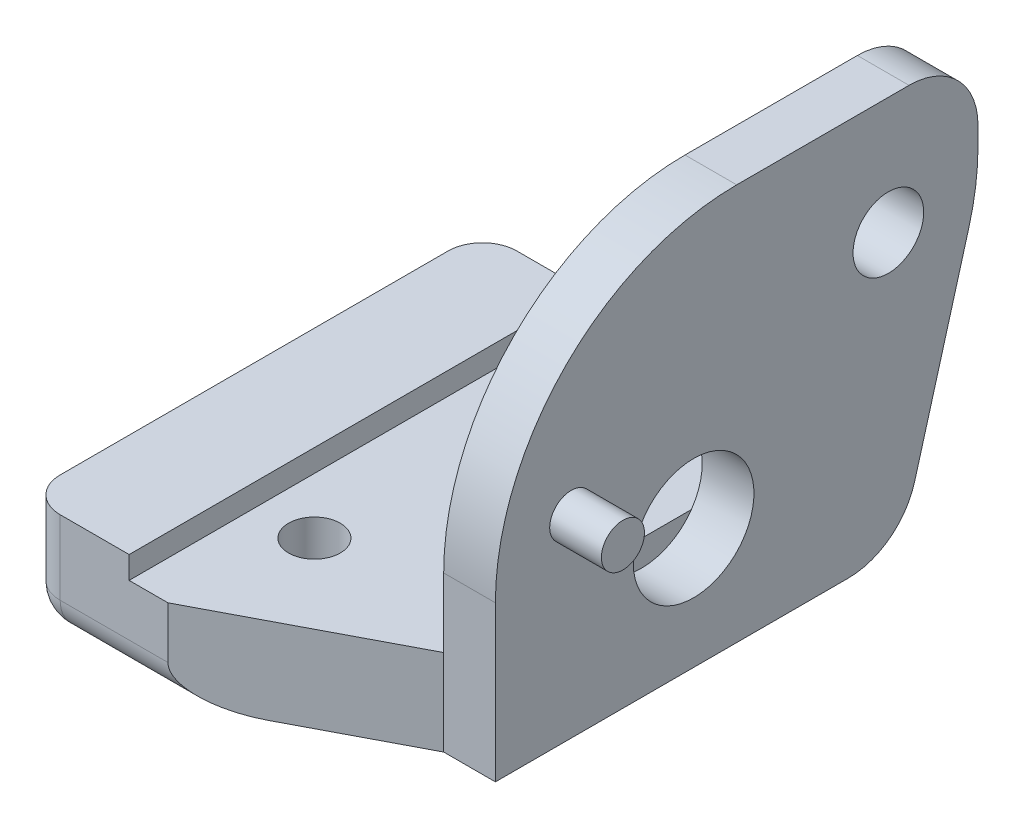
ISO-10303-21;
HEADER;
FILE_DESCRIPTION(('STEP AP214'),'2;1');
FILE_NAME('part.step','',(''),(''),'','','');
FILE_SCHEMA(('AUTOMOTIVE_DESIGN { 1 0 10303 214 1 1 1 1 }'));
ENDSEC;
DATA;
#1=APPLICATION_CONTEXT('core data for automotive mechanical design processes');
#2=APPLICATION_PROTOCOL_DEFINITION('international standard','automotive_design',2000,#1);
#3=PRODUCT_CONTEXT('',#1,'mechanical');
#4=PRODUCT('Part','Part','',(#3));
#5=PRODUCT_RELATED_PRODUCT_CATEGORY('part','',(#4));
#6=PRODUCT_DEFINITION_FORMATION('','',#4);
#7=PRODUCT_DEFINITION_CONTEXT('part definition',#1,'design');
#8=PRODUCT_DEFINITION('design','',#6,#7);
#9=PRODUCT_DEFINITION_SHAPE('','',#8);
#10=(LENGTH_UNIT() NAMED_UNIT(*) SI_UNIT(.MILLI.,.METRE.));
#11=(NAMED_UNIT(*) PLANE_ANGLE_UNIT() SI_UNIT($,.RADIAN.));
#12=(NAMED_UNIT(*) SI_UNIT($,.STERADIAN.) SOLID_ANGLE_UNIT());
#13=UNCERTAINTY_MEASURE_WITH_UNIT(LENGTH_MEASURE(1.E-05),#10,'distance_accuracy_value','');
#14=(GEOMETRIC_REPRESENTATION_CONTEXT(3) GLOBAL_UNCERTAINTY_ASSIGNED_CONTEXT((#13)) GLOBAL_UNIT_ASSIGNED_CONTEXT((#10,
#11,#12)) REPRESENTATION_CONTEXT('',''));
#15=CARTESIAN_POINT('',(0.,0.,0.));
#16=DIRECTION('',(0.,0.,1.));
#17=DIRECTION('',(1.,0.,0.));
#18=AXIS2_PLACEMENT_3D('',#15,#16,#17);
#19=CARTESIAN_POINT('',(21.75,14.,-29.5));
#20=DIRECTION('',(-1.,0.,0.));
#21=DIRECTION('',(0.,0.,1.));
#22=AXIS2_PLACEMENT_3D('',#19,#20,#21);
#23=CYLINDRICAL_SURFACE('',#22,4.);
#24=DIRECTION('',(-1.,0.,0.));
#25=VECTOR('',#24,1.);
#26=CARTESIAN_POINT('',(21.75,18.,-29.5));
#27=LINE('',#26,#25);
#28=CARTESIAN_POINT('',(21.75,18.,-29.5));
#29=VERTEX_POINT('',#28);
#30=CARTESIAN_POINT('',(18.75,18.,-29.5));
#31=VERTEX_POINT('',#30);
#32=EDGE_CURVE('E308',#29,#31,#27,.T.);
#33=ORIENTED_EDGE('',*,*,#32,.F.);
#34=CARTESIAN_POINT('',(21.75,14.,-29.5));
#35=DIRECTION('',(-1.,0.,0.));
#36=DIRECTION('',(0.,0.,1.));
#37=AXIS2_PLACEMENT_3D('',#34,#35,#36);
#38=CIRCLE('',#37,4.);
#39=CARTESIAN_POINT('',(21.75,14.,-33.5));
#40=VERTEX_POINT('',#39);
#41=EDGE_CURVE('E42',#40,#29,#38,.F.);
#42=ORIENTED_EDGE('',*,*,#41,.F.);
#43=DIRECTION('',(-1.,0.,0.));
#44=VECTOR('',#43,1.);
#45=CARTESIAN_POINT('',(21.75,14.,-33.5));
#46=LINE('',#45,#44);
#47=CARTESIAN_POINT('',(18.75,14.,-33.5));
#48=VERTEX_POINT('',#47);
#49=EDGE_CURVE('E311',#48,#40,#46,.F.);
#50=ORIENTED_EDGE('',*,*,#49,.F.);
#51=CARTESIAN_POINT('',(18.75,14.,-29.5));
#52=DIRECTION('',(-1.,0.,0.));
#53=DIRECTION('',(0.,0.,1.));
#54=AXIS2_PLACEMENT_3D('',#51,#52,#53);
#55=CIRCLE('',#54,4.);
#56=EDGE_CURVE('E11',#31,#48,#55,.T.);
#57=ORIENTED_EDGE('',*,*,#56,.F.);
#58=EDGE_LOOP('',(#33,#42,#50,#57));
#59=FACE_BOUND('',#58,.T.);
#60=ADVANCED_FACE('F35',(#59),#23,.T.);
#61=CARTESIAN_POINT('',(0.,-5.,0.));
#62=DIRECTION('',(0.,-1.,0.));
#63=DIRECTION('',(0.,0.,-1.));
#64=AXIS2_PLACEMENT_3D('',#61,#62,#63);
#65=PLANE('',#64);
#66=CARTESIAN_POINT('',(9.25,-5.,-22.5));
#67=DIRECTION('',(0.,1.,0.));
#68=DIRECTION('',(0.,0.,1.));
#69=AXIS2_PLACEMENT_3D('',#66,#67,#68);
#70=CIRCLE('',#69,1.5);
#71=CARTESIAN_POINT('',(9.25,-5.,-21.));
#72=VERTEX_POINT('',#71);
#73=EDGE_CURVE('E217',#72,#72,#70,.T.);
#74=ORIENTED_EDGE('',*,*,#73,.T.);
#75=EDGE_LOOP('',(#74));
#76=FACE_BOUND('',#75,.T.);
#77=CARTESIAN_POINT('',(9.24999999999999,-5.,-7.5));
#78=DIRECTION('',(0.,1.,0.));
#79=DIRECTION('',(0.,0.,1.));
#80=AXIS2_PLACEMENT_3D('',#77,#78,#79);
#81=CIRCLE('',#80,1.5);
#82=CARTESIAN_POINT('',(9.24999999999999,-5.,-6.));
#83=VERTEX_POINT('',#82);
#84=EDGE_CURVE('E420',#83,#83,#81,.T.);
#85=ORIENTED_EDGE('',*,*,#84,.T.);
#86=EDGE_LOOP('',(#85));
#87=FACE_BOUND('',#86,.T.);
#88=DIRECTION('',(0.,0.,-1.));
#89=VECTOR('',#88,1.);
#90=CARTESIAN_POINT('',(18.75,-5.,-33.5));
#91=LINE('',#90,#89);
#92=CARTESIAN_POINT('',(18.75,-5.,-24.5));
#93=VERTEX_POINT('',#92);
#94=CARTESIAN_POINT('',(18.75,-5.,-25.9698074653513));
#95=VERTEX_POINT('',#94);
#96=EDGE_CURVE('E192',#93,#95,#91,.T.);
#97=ORIENTED_EDGE('',*,*,#96,.T.);
#98=DIRECTION('',(-1.,0.,0.));
#99=VECTOR('',#98,1.);
#100=CARTESIAN_POINT('',(21.75,-5.,-25.9698074653513));
#101=LINE('',#100,#99);
#102=CARTESIAN_POINT('',(21.75,-5.,-25.9698074653513));
#103=VERTEX_POINT('',#102);
#104=EDGE_CURVE('E176',#103,#95,#101,.T.);
#105=ORIENTED_EDGE('',*,*,#104,.F.);
#106=DIRECTION('',(0.,0.,-1.));
#107=VECTOR('',#106,1.);
#108=CARTESIAN_POINT('',(21.75,-5.,-33.5));
#109=LINE('',#108,#107);
#110=CARTESIAN_POINT('',(21.75,-5.,-5.5));
#111=VERTEX_POINT('',#110);
#112=EDGE_CURVE('E190',#111,#103,#109,.T.);
#113=ORIENTED_EDGE('',*,*,#112,.F.);
#114=DIRECTION('',(-1.,0.,0.));
#115=VECTOR('',#114,1.);
#116=CARTESIAN_POINT('',(21.75,-5.,-5.5));
#117=LINE('',#116,#115);
#118=CARTESIAN_POINT('',(18.75,-5.,-5.5));
#119=VERTEX_POINT('',#118);
#120=EDGE_CURVE('E214',#111,#119,#117,.T.);
#121=ORIENTED_EDGE('',*,*,#120,.T.);
#122=DIRECTION('',(0.885831535280156,0.,-0.464006994670557));
#123=VECTOR('',#122,1.);
#124=CARTESIAN_POINT('',(18.75,-5.,-5.5));
#125=LINE('',#124,#123);
#126=CARTESIAN_POINT('',(12.0681818181818,-5.,-2.));
#127=VERTEX_POINT('',#126);
#128=EDGE_CURVE('E223',#127,#119,#125,.T.);
#129=ORIENTED_EDGE('',*,*,#128,.F.);
#130=DIRECTION('',(-1.,0.,0.));
#131=VECTOR('',#130,1.);
#132=CARTESIAN_POINT('',(0.,-5.,-2.));
#133=LINE('',#132,#131);
#134=CARTESIAN_POINT('',(2.,-5.,-2.));
#135=VERTEX_POINT('',#134);
#136=EDGE_CURVE('E274',#127,#135,#133,.T.);
#137=ORIENTED_EDGE('',*,*,#136,.T.);
#138=DIRECTION('',(0.,0.,-1.));
#139=VECTOR('',#138,1.);
#140=CARTESIAN_POINT('',(2.,-5.,0.));
#141=LINE('',#140,#139);
#142=CARTESIAN_POINT('',(2.,-5.,-24.5));
#143=VERTEX_POINT('',#142);
#144=EDGE_CURVE('E271',#135,#143,#141,.T.);
#145=ORIENTED_EDGE('',*,*,#144,.T.);
#146=DIRECTION('',(-1.,0.,0.));
#147=VECTOR('',#146,1.);
#148=CARTESIAN_POINT('',(0.,-5.,-24.5));
#149=LINE('',#148,#147);
#150=EDGE_CURVE('E258',#143,#93,#149,.F.);
#151=ORIENTED_EDGE('',*,*,#150,.T.);
#152=EDGE_LOOP('',(#97,#105,#113,#121,#129,#137,#145,#151));
#153=FACE_BOUND('',#152,.T.);
#154=ADVANCED_FACE('F188',(#76,#87,#153),#65,.T.);
#155=CARTESIAN_POINT('',(18.75,0.,0.));
#156=DIRECTION('',(-1.,0.,0.));
#157=DIRECTION('',(0.,0.,1.));
#158=AXIS2_PLACEMENT_3D('',#155,#156,#157);
#159=PLANE('',#158);
#160=DIRECTION('',(0.,0.,1.));
#161=VECTOR('',#160,1.);
#162=CARTESIAN_POINT('',(18.75,18.,-5.5));
#163=LINE('',#162,#161);
#164=CARTESIAN_POINT('',(18.75,18.,-19.5));
#165=VERTEX_POINT('',#164);
#166=EDGE_CURVE('E206',#31,#165,#163,.T.);
#167=ORIENTED_EDGE('',*,*,#166,.F.);
#168=ORIENTED_EDGE('',*,*,#56,.T.);
#169=DIRECTION('',(0.,1.,0.));
#170=VECTOR('',#169,1.);
#171=CARTESIAN_POINT('',(18.75,18.,-33.5));
#172=LINE('',#171,#170);
#173=CARTESIAN_POINT('',(18.75,12.9312848756279,-33.5));
#174=VERTEX_POINT('',#173);
#175=EDGE_CURVE('E216',#174,#48,#172,.T.);
#176=ORIENTED_EDGE('',*,*,#175,.F.);
#177=CARTESIAN_POINT('',(18.75,12.9312848756278,-19.5));
#178=DIRECTION('',(1.,0.,0.));
#179=DIRECTION('',(0.,0.,-1.));
#180=AXIS2_PLACEMENT_3D('',#177,#178,#179);
#181=CIRCLE('',#180,14.);
#182=CARTESIAN_POINT('',(18.75,9.14084679877177,-32.9771131621546));
#183=VERTEX_POINT('',#182);
#184=EDGE_CURVE('E183',#183,#174,#181,.T.);
#185=ORIENTED_EDGE('',*,*,#184,.F.);
#186=DIRECTION('',(0.,0.962650940153898,-0.270745576918287));
#187=VECTOR('',#186,1.);
#188=CARTESIAN_POINT('',(18.75,9.14084679877178,-32.9771131621546));
#189=LINE('',#188,#187);
#190=CARTESIAN_POINT('',(18.75,-2.08298230767314,-29.8204112259669));
#191=VERTEX_POINT('',#190);
#192=EDGE_CURVE('E368',#191,#183,#189,.T.);
#193=ORIENTED_EDGE('',*,*,#192,.F.);
#194=CARTESIAN_POINT('',(18.75,-0.999999999999997,-25.9698074653513));
#195=DIRECTION('',(1.,0.,0.));
#196=DIRECTION('',(0.,0.,1.));
#197=AXIS2_PLACEMENT_3D('',#194,#195,#196);
#198=CIRCLE('',#197,4.);
#199=EDGE_CURVE('E365',#95,#191,#198,.T.);
#200=ORIENTED_EDGE('',*,*,#199,.F.);
#201=ORIENTED_EDGE('',*,*,#96,.F.);
#202=CARTESIAN_POINT('',(18.75,-3.,-24.5));
#203=DIRECTION('',(-1.,0.,0.));
#204=DIRECTION('',(0.,0.,1.));
#205=AXIS2_PLACEMENT_3D('',#202,#203,#204);
#206=CIRCLE('',#205,2.);
#207=CARTESIAN_POINT('',(18.75,-3.,-26.5));
#208=VERTEX_POINT('',#207);
#209=EDGE_CURVE('E260',#208,#93,#206,.T.);
#210=ORIENTED_EDGE('',*,*,#209,.F.);
#211=DIRECTION('',(0.,1.,0.));
#212=VECTOR('',#211,1.);
#213=CARTESIAN_POINT('',(18.75,-5.,-26.5));
#214=LINE('',#213,#212);
#215=CARTESIAN_POINT('',(18.75,0.,-26.5));
#216=VERTEX_POINT('',#215);
#217=EDGE_CURVE('E238',#208,#216,#214,.T.);
#218=ORIENTED_EDGE('',*,*,#217,.T.);
#219=DIRECTION('',(0.,0.,-1.));
#220=VECTOR('',#219,1.);
#221=CARTESIAN_POINT('',(18.75,0.,-26.5));
#222=LINE('',#221,#220);
#223=CARTESIAN_POINT('',(18.75,0.,-19.872281323269));
#224=VERTEX_POINT('',#223);
#225=EDGE_CURVE('E232',#224,#216,#222,.T.);
#226=ORIENTED_EDGE('',*,*,#225,.F.);
#227=CARTESIAN_POINT('',(18.75,2.,-17.));
#228=DIRECTION('',(-1.,0.,0.));
#229=DIRECTION('',(0.,0.,1.));
#230=AXIS2_PLACEMENT_3D('',#227,#228,#229);
#231=CIRCLE('',#230,3.5);
#232=CARTESIAN_POINT('',(18.75,0.,-14.127718676731));
#233=VERTEX_POINT('',#232);
#234=EDGE_CURVE('E410',#233,#224,#231,.T.);
#235=ORIENTED_EDGE('',*,*,#234,.F.);
#236=CARTESIAN_POINT('',(18.75,0.,-5.5));
#237=VERTEX_POINT('',#236);
#238=EDGE_CURVE('E233',#237,#233,#222,.T.);
#239=ORIENTED_EDGE('',*,*,#238,.F.);
#240=DIRECTION('',(0.,-1.,0.));
#241=VECTOR('',#240,1.);
#242=CARTESIAN_POINT('',(18.75,-5.,-5.5));
#243=LINE('',#242,#241);
#244=CARTESIAN_POINT('',(18.75,4.,-5.5));
#245=VERTEX_POINT('',#244);
#246=EDGE_CURVE('E202',#245,#237,#243,.T.);
#247=ORIENTED_EDGE('',*,*,#246,.F.);
#248=CARTESIAN_POINT('',(18.75,4.,-19.5));
#249=DIRECTION('',(-1.,0.,0.));
#250=DIRECTION('',(0.,0.,1.));
#251=AXIS2_PLACEMENT_3D('',#248,#249,#250);
#252=CIRCLE('',#251,14.);
#253=EDGE_CURVE('E250',#245,#165,#252,.T.);
#254=ORIENTED_EDGE('',*,*,#253,.T.);
#255=EDGE_LOOP('',(#167,#168,#176,#185,#193,#200,#201,#210,#218,#226,#235,#239,#247,#254));
#256=FACE_BOUND('',#255,.T.);
#257=CARTESIAN_POINT('',(18.75,11.2030293432996,-28.3));
#258=DIRECTION('',(-1.,0.,0.));
#259=DIRECTION('',(0.,0.,1.));
#260=AXIS2_PLACEMENT_3D('',#257,#258,#259);
#261=CIRCLE('',#260,2.05);
#262=CARTESIAN_POINT('',(18.75,11.2030293432996,-26.25));
#263=VERTEX_POINT('',#262);
#264=EDGE_CURVE('E378',#263,#263,#261,.T.);
#265=ORIENTED_EDGE('',*,*,#264,.F.);
#266=EDGE_LOOP('',(#265));
#267=FACE_BOUND('',#266,.T.);
#268=ADVANCED_FACE('F360',(#256,#267),#159,.T.);
#269=CARTESIAN_POINT('',(21.75,18.,-33.5));
#270=DIRECTION('',(0.,0.,1.));
#271=DIRECTION('',(1.,0.,0.));
#272=AXIS2_PLACEMENT_3D('',#269,#270,#271);
#273=PLANE('',#272);
#274=ORIENTED_EDGE('',*,*,#175,.T.);
#275=ORIENTED_EDGE('',*,*,#49,.T.);
#276=DIRECTION('',(0.,1.,0.));
#277=VECTOR('',#276,1.);
#278=CARTESIAN_POINT('',(21.75,18.,-33.5));
#279=LINE('',#278,#277);
#280=CARTESIAN_POINT('',(21.75,12.9312848756279,-33.5));
#281=VERTEX_POINT('',#280);
#282=EDGE_CURVE('E201',#281,#40,#279,.T.);
#283=ORIENTED_EDGE('',*,*,#282,.F.);
#284=DIRECTION('',(-1.,0.,0.));
#285=VECTOR('',#284,1.);
#286=CARTESIAN_POINT('',(21.75,12.9312848756279,-33.5));
#287=LINE('',#286,#285);
#288=EDGE_CURVE('E375',#281,#174,#287,.T.);
#289=ORIENTED_EDGE('',*,*,#288,.T.);
#290=EDGE_LOOP('',(#274,#275,#283,#289));
#291=FACE_BOUND('',#290,.T.);
#292=ADVANCED_FACE('F460',(#291),#273,.F.);
#293=CARTESIAN_POINT('',(21.75,0.,0.));
#294=DIRECTION('',(-1.,0.,0.));
#295=DIRECTION('',(0.,0.,1.));
#296=AXIS2_PLACEMENT_3D('',#293,#294,#295);
#297=PLANE('',#296);
#298=ORIENTED_EDGE('',*,*,#282,.T.);
#299=ORIENTED_EDGE('',*,*,#41,.T.);
#300=DIRECTION('',(0.,0.,1.));
#301=VECTOR('',#300,1.);
#302=CARTESIAN_POINT('',(21.75,18.,-5.5));
#303=LINE('',#302,#301);
#304=CARTESIAN_POINT('',(21.75,18.,-19.5));
#305=VERTEX_POINT('',#304);
#306=EDGE_CURVE('E204',#29,#305,#303,.T.);
#307=ORIENTED_EDGE('',*,*,#306,.T.);
#308=CARTESIAN_POINT('',(21.75,4.,-19.5));
#309=DIRECTION('',(-1.,0.,0.));
#310=DIRECTION('',(0.,0.,1.));
#311=AXIS2_PLACEMENT_3D('',#308,#309,#310);
#312=CIRCLE('',#311,14.);
#313=CARTESIAN_POINT('',(21.75,4.,-5.5));
#314=VERTEX_POINT('',#313);
#315=EDGE_CURVE('E253',#305,#314,#312,.F.);
#316=ORIENTED_EDGE('',*,*,#315,.T.);
#317=DIRECTION('',(0.,-1.,0.));
#318=VECTOR('',#317,1.);
#319=CARTESIAN_POINT('',(21.75,-5.,-5.5));
#320=LINE('',#319,#318);
#321=EDGE_CURVE('E199',#314,#111,#320,.T.);
#322=ORIENTED_EDGE('',*,*,#321,.T.);
#323=ORIENTED_EDGE('',*,*,#112,.T.);
#324=CARTESIAN_POINT('',(21.75,-0.999999999999997,-25.9698074653513));
#325=DIRECTION('',(1.,0.,0.));
#326=DIRECTION('',(0.,0.,1.));
#327=AXIS2_PLACEMENT_3D('',#324,#325,#326);
#328=CIRCLE('',#327,4.);
#329=CARTESIAN_POINT('',(21.75,-2.08298230767314,-29.8204112259669));
#330=VERTEX_POINT('',#329);
#331=EDGE_CURVE('E172',#103,#330,#328,.T.);
#332=ORIENTED_EDGE('',*,*,#331,.T.);
#333=DIRECTION('',(0.,0.962650940153898,-0.270745576918287));
#334=VECTOR('',#333,1.);
#335=CARTESIAN_POINT('',(21.75,9.14084679877178,-32.9771131621546));
#336=LINE('',#335,#334);
#337=CARTESIAN_POINT('',(21.75,9.14084679877177,-32.9771131621546));
#338=VERTEX_POINT('',#337);
#339=EDGE_CURVE('E182',#330,#338,#336,.T.);
#340=ORIENTED_EDGE('',*,*,#339,.T.);
#341=CARTESIAN_POINT('',(21.75,12.9312848756278,-19.5));
#342=DIRECTION('',(1.,0.,0.));
#343=DIRECTION('',(0.,0.,-1.));
#344=AXIS2_PLACEMENT_3D('',#341,#342,#343);
#345=CIRCLE('',#344,14.);
#346=EDGE_CURVE('E193',#338,#281,#345,.T.);
#347=ORIENTED_EDGE('',*,*,#346,.T.);
#348=EDGE_LOOP('',(#298,#299,#307,#316,#322,#323,#332,#340,#347));
#349=FACE_BOUND('',#348,.T.);
#350=CARTESIAN_POINT('',(21.75,11.2030293432996,-28.3));
#351=DIRECTION('',(-1.,0.,0.));
#352=DIRECTION('',(0.,0.,1.));
#353=AXIS2_PLACEMENT_3D('',#350,#351,#352);
#354=CIRCLE('',#353,2.05);
#355=CARTESIAN_POINT('',(21.75,11.2030293432996,-26.25));
#356=VERTEX_POINT('',#355);
#357=EDGE_CURVE('E382',#356,#356,#354,.T.);
#358=ORIENTED_EDGE('',*,*,#357,.T.);
#359=EDGE_LOOP('',(#358));
#360=FACE_BOUND('',#359,.T.);
#361=CARTESIAN_POINT('',(21.75,2.,-17.));
#362=DIRECTION('',(-1.,0.,0.));
#363=DIRECTION('',(0.,0.,1.));
#364=AXIS2_PLACEMENT_3D('',#361,#362,#363);
#365=CIRCLE('',#364,3.5);
#366=CARTESIAN_POINT('',(21.75,2.,-13.5));
#367=VERTEX_POINT('',#366);
#368=EDGE_CURVE('E411',#367,#367,#365,.T.);
#369=ORIENTED_EDGE('',*,*,#368,.T.);
#370=EDGE_LOOP('',(#369));
#371=FACE_BOUND('',#370,.T.);
#372=CARTESIAN_POINT('',(21.75,6.2,-9.9));
#373=DIRECTION('',(-1.,0.,0.));
#374=DIRECTION('',(0.,0.,1.));
#375=AXIS2_PLACEMENT_3D('',#372,#373,#374);
#376=CIRCLE('',#375,1.25);
#377=CARTESIAN_POINT('',(21.75,6.2,-8.65));
#378=VERTEX_POINT('',#377);
#379=EDGE_CURVE('E390',#378,#378,#376,.T.);
#380=ORIENTED_EDGE('',*,*,#379,.T.);
#381=EDGE_LOOP('',(#380));
#382=FACE_BOUND('',#381,.T.);
#383=ADVANCED_FACE('F196',(#349,#360,#371,#382),#297,.F.);
#384=CARTESIAN_POINT('',(2.,-3.,-24.5));
#385=DIRECTION('',(-1.,0.,0.));
#386=DIRECTION('',(0.,0.,1.));
#387=AXIS2_PLACEMENT_3D('',#384,#385,#386);
#388=SPHERICAL_SURFACE('',#387,2.);
#389=CARTESIAN_POINT('',(2.,-3.,-24.5));
#390=DIRECTION('',(0.,1.,0.));
#391=DIRECTION('',(0.,0.,1.));
#392=AXIS2_PLACEMENT_3D('',#389,#390,#391);
#393=CIRCLE('',#392,2.);
#394=CARTESIAN_POINT('',(2.,-3.,-26.5));
#395=VERTEX_POINT('',#394);
#396=CARTESIAN_POINT('',(0.,-3.,-24.5));
#397=VERTEX_POINT('',#396);
#398=EDGE_CURVE('E306',#395,#397,#393,.T.);
#399=ORIENTED_EDGE('',*,*,#398,.F.);
#400=CARTESIAN_POINT('',(2.,-3.,-24.5));
#401=DIRECTION('',(-1.,0.,0.));
#402=DIRECTION('',(0.,0.,1.));
#403=AXIS2_PLACEMENT_3D('',#400,#401,#402);
#404=CIRCLE('',#403,2.);
#405=EDGE_CURVE('E291',#143,#395,#404,.F.);
#406=ORIENTED_EDGE('',*,*,#405,.F.);
#407=CARTESIAN_POINT('',(2.,-3.,-24.5));
#408=DIRECTION('',(0.,0.,-1.));
#409=DIRECTION('',(-1.,0.,0.));
#410=AXIS2_PLACEMENT_3D('',#407,#408,#409);
#411=CIRCLE('',#410,2.);
#412=EDGE_CURVE('E303',#143,#397,#411,.T.);
#413=ORIENTED_EDGE('',*,*,#412,.T.);
#414=EDGE_LOOP('',(#399,#406,#413));
#415=FACE_BOUND('',#414,.T.);
#416=ADVANCED_FACE('F451',(#415),#388,.T.);
#417=CARTESIAN_POINT('',(2.,-3.,0.));
#418=DIRECTION('',(0.,0.,-1.));
#419=DIRECTION('',(-1.,0.,0.));
#420=AXIS2_PLACEMENT_3D('',#417,#418,#419);
#421=CYLINDRICAL_SURFACE('',#420,2.);
#422=ORIENTED_EDGE('',*,*,#412,.F.);
#423=ORIENTED_EDGE('',*,*,#144,.F.);
#424=CARTESIAN_POINT('',(2.,-3.,-2.));
#425=DIRECTION('',(0.,0.,-1.));
#426=DIRECTION('',(-1.,0.,0.));
#427=AXIS2_PLACEMENT_3D('',#424,#425,#426);
#428=CIRCLE('',#427,2.);
#429=CARTESIAN_POINT('',(0.,-3.,-2.));
#430=VERTEX_POINT('',#429);
#431=EDGE_CURVE('E301',#135,#430,#428,.T.);
#432=ORIENTED_EDGE('',*,*,#431,.T.);
#433=DIRECTION('',(0.,0.,-1.));
#434=VECTOR('',#433,1.);
#435=CARTESIAN_POINT('',(0.,-3.,0.));
#436=LINE('',#435,#434);
#437=EDGE_CURVE('E288',#397,#430,#436,.F.);
#438=ORIENTED_EDGE('',*,*,#437,.F.);
#439=EDGE_LOOP('',(#422,#423,#432,#438));
#440=FACE_BOUND('',#439,.T.);
#441=ADVANCED_FACE('F353',(#440),#421,.T.);
#442=CARTESIAN_POINT('',(2.,-3.,-2.));
#443=DIRECTION('',(0.,-1.,0.));
#444=DIRECTION('',(0.,0.,-1.));
#445=AXIS2_PLACEMENT_3D('',#442,#443,#444);
#446=SPHERICAL_SURFACE('',#445,2.);
#447=ORIENTED_EDGE('',*,*,#431,.F.);
#448=CARTESIAN_POINT('',(2.,-3.,-2.));
#449=DIRECTION('',(-1.,0.,0.));
#450=DIRECTION('',(0.,0.,1.));
#451=AXIS2_PLACEMENT_3D('',#448,#449,#450);
#452=CIRCLE('',#451,2.);
#453=CARTESIAN_POINT('',(2.,-3.,0.));
#454=VERTEX_POINT('',#453);
#455=EDGE_CURVE('E299',#135,#454,#452,.T.);
#456=ORIENTED_EDGE('',*,*,#455,.T.);
#457=CARTESIAN_POINT('',(2.,-3.,-2.));
#458=DIRECTION('',(0.,-1.,0.));
#459=DIRECTION('',(0.,0.,-1.));
#460=AXIS2_PLACEMENT_3D('',#457,#458,#459);
#461=CIRCLE('',#460,2.);
#462=EDGE_CURVE('E282',#430,#454,#461,.F.);
#463=ORIENTED_EDGE('',*,*,#462,.F.);
#464=EDGE_LOOP('',(#447,#456,#463));
#465=FACE_BOUND('',#464,.T.);
#466=ADVANCED_FACE('F339',(#465),#446,.T.);
#467=CARTESIAN_POINT('',(0.,-3.,-2.));
#468=DIRECTION('',(-1.,0.,0.));
#469=DIRECTION('',(0.,0.,1.));
#470=AXIS2_PLACEMENT_3D('',#467,#468,#469);
#471=CYLINDRICAL_SURFACE('',#470,2.);
#472=ORIENTED_EDGE('',*,*,#455,.F.);
#473=ORIENTED_EDGE('',*,*,#136,.F.);
#474=CARTESIAN_POINT('',(12.0681818181818,-3.,-2.));
#475=DIRECTION('',(0.464006994670557,0.,0.885831535280156));
#476=DIRECTION('',(-0.885831535280156,0.,0.464006994670557));
#477=AXIS2_PLACEMENT_3D('',#474,#475,#476);
#478=ELLIPSE('',#477,4.31027985131989,2.);
#479=CARTESIAN_POINT('',(8.25,-3.,0.));
#480=VERTEX_POINT('',#479);
#481=EDGE_CURVE('E280',#480,#127,#478,.T.);
#482=ORIENTED_EDGE('',*,*,#481,.F.);
#483=DIRECTION('',(-1.,0.,0.));
#484=VECTOR('',#483,1.);
#485=CARTESIAN_POINT('',(0.,-3.,0.));
#486=LINE('',#485,#484);
#487=EDGE_CURVE('E277',#454,#480,#486,.F.);
#488=ORIENTED_EDGE('',*,*,#487,.F.);
#489=EDGE_LOOP('',(#472,#473,#482,#488));
#490=FACE_BOUND('',#489,.T.);
#491=ADVANCED_FACE('F336',(#490),#471,.T.);
#492=CARTESIAN_POINT('',(2.,-5.,-24.5));
#493=DIRECTION('',(0.,1.,0.));
#494=DIRECTION('',(0.,0.,1.));
#495=AXIS2_PLACEMENT_3D('',#492,#493,#494);
#496=CYLINDRICAL_SURFACE('',#495,2.);
#497=DIRECTION('',(0.,1.,0.));
#498=VECTOR('',#497,1.);
#499=CARTESIAN_POINT('',(2.,-5.,-26.5));
#500=LINE('',#499,#498);
#501=CARTESIAN_POINT('',(2.,1.3,-26.5));
#502=VERTEX_POINT('',#501);
#503=EDGE_CURVE('E294',#395,#502,#500,.T.);
#504=ORIENTED_EDGE('',*,*,#503,.F.);
#505=ORIENTED_EDGE('',*,*,#398,.T.);
#506=DIRECTION('',(0.,1.,0.));
#507=VECTOR('',#506,1.);
#508=CARTESIAN_POINT('',(0.,-5.,-24.5));
#509=LINE('',#508,#507);
#510=CARTESIAN_POINT('',(0.,1.3,-24.5));
#511=VERTEX_POINT('',#510);
#512=EDGE_CURVE('E285',#511,#397,#509,.F.);
#513=ORIENTED_EDGE('',*,*,#512,.F.);
#514=CARTESIAN_POINT('',(2.,1.3,-24.5));
#515=DIRECTION('',(0.,-1.,0.));
#516=DIRECTION('',(0.,0.,-1.));
#517=AXIS2_PLACEMENT_3D('',#514,#515,#516);
#518=CIRCLE('',#517,2.);
#519=EDGE_CURVE('E297',#502,#511,#518,.F.);
#520=ORIENTED_EDGE('',*,*,#519,.F.);
#521=EDGE_LOOP('',(#504,#505,#513,#520));
#522=FACE_BOUND('',#521,.T.);
#523=ADVANCED_FACE('F449',(#522),#496,.T.);
#524=CARTESIAN_POINT('',(2.,-5.,-2.));
#525=DIRECTION('',(0.,-1.,0.));
#526=DIRECTION('',(0.,0.,-1.));
#527=AXIS2_PLACEMENT_3D('',#524,#525,#526);
#528=CYLINDRICAL_SURFACE('',#527,2.);
#529=DIRECTION('',(0.,-1.,0.));
#530=VECTOR('',#529,1.);
#531=CARTESIAN_POINT('',(0.,-5.,-2.));
#532=LINE('',#531,#530);
#533=CARTESIAN_POINT('',(0.,1.3,-2.));
#534=VERTEX_POINT('',#533);
#535=EDGE_CURVE('E266',#430,#534,#532,.F.);
#536=ORIENTED_EDGE('',*,*,#535,.F.);
#537=ORIENTED_EDGE('',*,*,#462,.T.);
#538=DIRECTION('',(0.,-1.,0.));
#539=VECTOR('',#538,1.);
#540=CARTESIAN_POINT('',(2.,-5.,0.));
#541=LINE('',#540,#539);
#542=CARTESIAN_POINT('',(2.,1.3,0.));
#543=VERTEX_POINT('',#542);
#544=EDGE_CURVE('E263',#543,#454,#541,.T.);
#545=ORIENTED_EDGE('',*,*,#544,.F.);
#546=CARTESIAN_POINT('',(2.,1.3,-2.));
#547=DIRECTION('',(0.,-1.,0.));
#548=DIRECTION('',(0.,0.,-1.));
#549=AXIS2_PLACEMENT_3D('',#546,#547,#548);
#550=CIRCLE('',#549,2.);
#551=EDGE_CURVE('E269',#534,#543,#550,.F.);
#552=ORIENTED_EDGE('',*,*,#551,.F.);
#553=EDGE_LOOP('',(#536,#537,#545,#552));
#554=FACE_BOUND('',#553,.T.);
#555=ADVANCED_FACE('F343',(#554),#528,.T.);
#556=CARTESIAN_POINT('',(0.,0.,0.));
#557=DIRECTION('',(0.,-1.,0.));
#558=DIRECTION('',(0.,0.,-1.));
#559=AXIS2_PLACEMENT_3D('',#556,#557,#558);
#560=PLANE('',#559);
#561=CARTESIAN_POINT('',(9.24999999999999,0.,-7.5));
#562=DIRECTION('',(0.,1.,0.));
#563=DIRECTION('',(0.,0.,1.));
#564=AXIS2_PLACEMENT_3D('',#561,#562,#563);
#565=CIRCLE('',#564,1.5);
#566=CARTESIAN_POINT('',(9.24999999999999,0.,-6.));
#567=VERTEX_POINT('',#566);
#568=EDGE_CURVE('E209',#567,#567,#565,.T.);
#569=ORIENTED_EDGE('',*,*,#568,.F.);
#570=EDGE_LOOP('',(#569));
#571=FACE_BOUND('',#570,.T.);
#572=CARTESIAN_POINT('',(9.25,0.,-22.5));
#573=DIRECTION('',(0.,1.,0.));
#574=DIRECTION('',(0.,0.,1.));
#575=AXIS2_PLACEMENT_3D('',#572,#573,#574);
#576=CIRCLE('',#575,1.5);
#577=CARTESIAN_POINT('',(9.25,0.,-21.));
#578=VERTEX_POINT('',#577);
#579=EDGE_CURVE('E418',#578,#578,#576,.T.);
#580=ORIENTED_EDGE('',*,*,#579,.F.);
#581=EDGE_LOOP('',(#580));
#582=FACE_BOUND('',#581,.T.);
#583=DIRECTION('',(0.,0.,-1.));
#584=VECTOR('',#583,1.);
#585=CARTESIAN_POINT('',(6.,0.,-26.5));
#586=LINE('',#585,#584);
#587=CARTESIAN_POINT('',(6.,0.,0.));
#588=VERTEX_POINT('',#587);
#589=CARTESIAN_POINT('',(6.,0.,-26.5));
#590=VERTEX_POINT('',#589);
#591=EDGE_CURVE('E393',#588,#590,#586,.T.);
#592=ORIENTED_EDGE('',*,*,#591,.F.);
#593=DIRECTION('',(1.,0.,0.));
#594=VECTOR('',#593,1.);
#595=CARTESIAN_POINT('',(0.,0.,0.));
#596=LINE('',#595,#594);
#597=CARTESIAN_POINT('',(8.25,0.,0.));
#598=VERTEX_POINT('',#597);
#599=EDGE_CURVE('E222',#588,#598,#596,.T.);
#600=ORIENTED_EDGE('',*,*,#599,.T.);
#601=DIRECTION('',(0.885831535280156,0.,-0.464006994670557));
#602=VECTOR('',#601,1.);
#603=CARTESIAN_POINT('',(18.75,0.,-5.5));
#604=LINE('',#603,#602);
#605=EDGE_CURVE('E229',#598,#237,#604,.T.);
#606=ORIENTED_EDGE('',*,*,#605,.T.);
#607=ORIENTED_EDGE('',*,*,#238,.T.);
#608=EDGE_CURVE('E236',#233,#224,#222,.T.);
#609=ORIENTED_EDGE('',*,*,#608,.T.);
#610=ORIENTED_EDGE('',*,*,#225,.T.);
#611=DIRECTION('',(-1.,0.,0.));
#612=VECTOR('',#611,1.);
#613=CARTESIAN_POINT('',(0.,0.,-26.5));
#614=LINE('',#613,#612);
#615=EDGE_CURVE('E226',#216,#590,#614,.T.);
#616=ORIENTED_EDGE('',*,*,#615,.T.);
#617=EDGE_LOOP('',(#592,#600,#606,#607,#609,#610,#616));
#618=FACE_BOUND('',#617,.T.);
#619=ADVANCED_FACE('F429',(#571,#582,#618),#560,.F.);
#620=CARTESIAN_POINT('',(0.,-3.,-24.5));
#621=DIRECTION('',(-1.,0.,0.));
#622=DIRECTION('',(0.,0.,1.));
#623=AXIS2_PLACEMENT_3D('',#620,#621,#622);
#624=CYLINDRICAL_SURFACE('',#623,2.);
#625=ORIENTED_EDGE('',*,*,#150,.F.);
#626=ORIENTED_EDGE('',*,*,#405,.T.);
#627=DIRECTION('',(-1.,0.,0.));
#628=VECTOR('',#627,1.);
#629=CARTESIAN_POINT('',(0.,-3.,-26.5));
#630=LINE('',#629,#628);
#631=EDGE_CURVE('E255',#208,#395,#630,.T.);
#632=ORIENTED_EDGE('',*,*,#631,.F.);
#633=ORIENTED_EDGE('',*,*,#209,.T.);
#634=EDGE_LOOP('',(#625,#626,#632,#633));
#635=FACE_BOUND('',#634,.T.);
#636=ADVANCED_FACE('F357',(#635),#624,.T.);
#637=CARTESIAN_POINT('',(21.75,4.,-19.5));
#638=DIRECTION('',(1.,0.,0.));
#639=DIRECTION('',(0.,0.,-1.));
#640=AXIS2_PLACEMENT_3D('',#637,#638,#639);
#641=CYLINDRICAL_SURFACE('',#640,14.);
#642=DIRECTION('',(1.,0.,0.));
#643=VECTOR('',#642,1.);
#644=CARTESIAN_POINT('',(21.75,18.,-19.5));
#645=LINE('',#644,#643);
#646=EDGE_CURVE('E240',#165,#305,#645,.T.);
#647=ORIENTED_EDGE('',*,*,#646,.F.);
#648=ORIENTED_EDGE('',*,*,#253,.F.);
#649=DIRECTION('',(1.,0.,0.));
#650=VECTOR('',#649,1.);
#651=CARTESIAN_POINT('',(21.75,4.,-5.5));
#652=LINE('',#651,#650);
#653=EDGE_CURVE('E247',#314,#245,#652,.F.);
#654=ORIENTED_EDGE('',*,*,#653,.F.);
#655=ORIENTED_EDGE('',*,*,#315,.F.);
#656=EDGE_LOOP('',(#647,#648,#654,#655));
#657=FACE_BOUND('',#656,.T.);
#658=ADVANCED_FACE('F320',(#657),#641,.T.);
#659=CARTESIAN_POINT('',(0.,-5.,0.));
#660=DIRECTION('',(-1.,0.,0.));
#661=DIRECTION('',(0.,0.,1.));
#662=AXIS2_PLACEMENT_3D('',#659,#660,#661);
#663=PLANE('',#662);
#664=ORIENTED_EDGE('',*,*,#512,.T.);
#665=ORIENTED_EDGE('',*,*,#437,.T.);
#666=ORIENTED_EDGE('',*,*,#535,.T.);
#667=DIRECTION('',(0.,0.,1.));
#668=VECTOR('',#667,1.);
#669=CARTESIAN_POINT('',(0.,1.3,0.));
#670=LINE('',#669,#668);
#671=EDGE_CURVE('E349',#511,#534,#670,.T.);
#672=ORIENTED_EDGE('',*,*,#671,.F.);
#673=EDGE_LOOP('',(#664,#665,#666,#672));
#674=FACE_BOUND('',#673,.T.);
#675=ADVANCED_FACE('F348',(#674),#663,.T.);
#676=CARTESIAN_POINT('',(0.,-5.,-26.5));
#677=DIRECTION('',(0.,0.,-1.));
#678=DIRECTION('',(-1.,0.,0.));
#679=AXIS2_PLACEMENT_3D('',#676,#677,#678);
#680=PLANE('',#679);
#681=ORIENTED_EDGE('',*,*,#631,.T.);
#682=ORIENTED_EDGE('',*,*,#503,.T.);
#683=DIRECTION('',(-1.,0.,0.));
#684=VECTOR('',#683,1.);
#685=CARTESIAN_POINT('',(0.,1.3,-26.5));
#686=LINE('',#685,#684);
#687=CARTESIAN_POINT('',(6.,1.3,-26.5));
#688=VERTEX_POINT('',#687);
#689=EDGE_CURVE('E399',#688,#502,#686,.T.);
#690=ORIENTED_EDGE('',*,*,#689,.F.);
#691=DIRECTION('',(0.,-1.,0.));
#692=VECTOR('',#691,1.);
#693=CARTESIAN_POINT('',(6.,1.3,-26.5));
#694=LINE('',#693,#692);
#695=EDGE_CURVE('E402',#688,#590,#694,.T.);
#696=ORIENTED_EDGE('',*,*,#695,.T.);
#697=ORIENTED_EDGE('',*,*,#615,.F.);
#698=ORIENTED_EDGE('',*,*,#217,.F.);
#699=EDGE_LOOP('',(#681,#682,#690,#696,#697,#698));
#700=FACE_BOUND('',#699,.T.);
#701=ADVANCED_FACE('F478',(#700),#680,.T.);
#702=CARTESIAN_POINT('',(18.75,-5.,-5.5));
#703=DIRECTION('',(0.464006994670557,0.,0.885831535280156));
#704=DIRECTION('',(0.885831535280156,0.,-0.464006994670557));
#705=AXIS2_PLACEMENT_3D('',#702,#703,#704);
#706=PLANE('',#705);
#707=DIRECTION('',(0.,1.,0.));
#708=VECTOR('',#707,1.);
#709=CARTESIAN_POINT('',(8.25,-5.,0.));
#710=LINE('',#709,#708);
#711=EDGE_CURVE('E225',#480,#598,#710,.T.);
#712=ORIENTED_EDGE('',*,*,#711,.F.);
#713=ORIENTED_EDGE('',*,*,#481,.T.);
#714=ORIENTED_EDGE('',*,*,#128,.T.);
#715=DIRECTION('',(0.,1.,0.));
#716=VECTOR('',#715,1.);
#717=CARTESIAN_POINT('',(18.75,-5.,-5.5));
#718=LINE('',#717,#716);
#719=EDGE_CURVE('E241',#119,#237,#718,.T.);
#720=ORIENTED_EDGE('',*,*,#719,.T.);
#721=ORIENTED_EDGE('',*,*,#605,.F.);
#722=EDGE_LOOP('',(#712,#713,#714,#720,#721));
#723=FACE_BOUND('',#722,.T.);
#724=ADVANCED_FACE('F331',(#723),#706,.T.);
#725=CARTESIAN_POINT('',(0.,-5.,0.));
#726=DIRECTION('',(0.,0.,1.));
#727=DIRECTION('',(1.,0.,0.));
#728=AXIS2_PLACEMENT_3D('',#725,#726,#727);
#729=PLANE('',#728);
#730=ORIENTED_EDGE('',*,*,#544,.T.);
#731=ORIENTED_EDGE('',*,*,#487,.T.);
#732=ORIENTED_EDGE('',*,*,#711,.T.);
#733=ORIENTED_EDGE('',*,*,#599,.F.);
#734=DIRECTION('',(0.,-1.,0.));
#735=VECTOR('',#734,1.);
#736=CARTESIAN_POINT('',(6.,1.3,0.));
#737=LINE('',#736,#735);
#738=CARTESIAN_POINT('',(6.,1.3,0.));
#739=VERTEX_POINT('',#738);
#740=EDGE_CURVE('E407',#739,#588,#737,.T.);
#741=ORIENTED_EDGE('',*,*,#740,.F.);
#742=DIRECTION('',(1.,0.,0.));
#743=VECTOR('',#742,1.);
#744=CARTESIAN_POINT('',(6.,1.3,0.));
#745=LINE('',#744,#743);
#746=EDGE_CURVE('E395',#543,#739,#745,.T.);
#747=ORIENTED_EDGE('',*,*,#746,.F.);
#748=EDGE_LOOP('',(#730,#731,#732,#733,#741,#747));
#749=FACE_BOUND('',#748,.T.);
#750=ADVANCED_FACE('F441',(#749),#729,.T.);
#751=CARTESIAN_POINT('',(21.75,18.,-5.5));
#752=DIRECTION('',(0.,-1.,0.));
#753=DIRECTION('',(0.,0.,-1.));
#754=AXIS2_PLACEMENT_3D('',#751,#752,#753);
#755=PLANE('',#754);
#756=ORIENTED_EDGE('',*,*,#306,.F.);
#757=ORIENTED_EDGE('',*,*,#32,.T.);
#758=ORIENTED_EDGE('',*,*,#166,.T.);
#759=ORIENTED_EDGE('',*,*,#646,.T.);
#760=EDGE_LOOP('',(#756,#757,#758,#759));
#761=FACE_BOUND('',#760,.T.);
#762=ADVANCED_FACE('F317',(#761),#755,.F.);
#763=CARTESIAN_POINT('',(21.75,-5.,-5.5));
#764=DIRECTION('',(0.,0.,-1.));
#765=DIRECTION('',(-1.,0.,0.));
#766=AXIS2_PLACEMENT_3D('',#763,#764,#765);
#767=PLANE('',#766);
#768=ORIENTED_EDGE('',*,*,#321,.F.);
#769=ORIENTED_EDGE('',*,*,#653,.T.);
#770=ORIENTED_EDGE('',*,*,#246,.T.);
#771=ORIENTED_EDGE('',*,*,#719,.F.);
#772=ORIENTED_EDGE('',*,*,#120,.F.);
#773=EDGE_LOOP('',(#768,#769,#770,#771,#772));
#774=FACE_BOUND('',#773,.T.);
#775=ADVANCED_FACE('F324',(#774),#767,.F.);
#776=CARTESIAN_POINT('',(9.24999999999999,-5.,-7.5));
#777=DIRECTION('',(0.,1.,0.));
#778=DIRECTION('',(0.,0.,1.));
#779=AXIS2_PLACEMENT_3D('',#776,#777,#778);
#780=CYLINDRICAL_SURFACE('',#779,1.5);
#781=ORIENTED_EDGE('',*,*,#84,.F.);
#782=EDGE_LOOP('',(#781));
#783=FACE_BOUND('',#782,.T.);
#784=ORIENTED_EDGE('',*,*,#568,.T.);
#785=EDGE_LOOP('',(#784));
#786=FACE_BOUND('',#785,.T.);
#787=ADVANCED_FACE('F427',(#783,#786),#780,.F.);
#788=CARTESIAN_POINT('',(9.25,-5.,-22.5));
#789=DIRECTION('',(0.,1.,0.));
#790=DIRECTION('',(0.,0.,1.));
#791=AXIS2_PLACEMENT_3D('',#788,#789,#790);
#792=CYLINDRICAL_SURFACE('',#791,1.5);
#793=ORIENTED_EDGE('',*,*,#73,.F.);
#794=EDGE_LOOP('',(#793));
#795=FACE_BOUND('',#794,.T.);
#796=ORIENTED_EDGE('',*,*,#579,.T.);
#797=EDGE_LOOP('',(#796));
#798=FACE_BOUND('',#797,.T.);
#799=ADVANCED_FACE('F557',(#795,#798),#792,.F.);
#800=CARTESIAN_POINT('',(18.75,2.,-17.));
#801=DIRECTION('',(-1.,0.,0.));
#802=DIRECTION('',(0.,0.,1.));
#803=AXIS2_PLACEMENT_3D('',#800,#801,#802);
#804=PLANE('',#803);
#805=EDGE_CURVE('E414',#224,#233,#231,.T.);
#806=ORIENTED_EDGE('',*,*,#805,.F.);
#807=ORIENTED_EDGE('',*,*,#608,.F.);
#808=EDGE_LOOP('',(#806,#807));
#809=FACE_BOUND('',#808,.T.);
#810=ADVANCED_FACE('F565',(#809),#804,.F.);
#811=CARTESIAN_POINT('',(21.75,2.,-17.));
#812=DIRECTION('',(-1.,0.,0.));
#813=DIRECTION('',(0.,0.,1.));
#814=AXIS2_PLACEMENT_3D('',#811,#812,#813);
#815=CYLINDRICAL_SURFACE('',#814,3.5);
#816=ORIENTED_EDGE('',*,*,#368,.F.);
#817=EDGE_LOOP('',(#816));
#818=FACE_BOUND('',#817,.T.);
#819=ORIENTED_EDGE('',*,*,#805,.T.);
#820=ORIENTED_EDGE('',*,*,#234,.T.);
#821=EDGE_LOOP('',(#819,#820));
#822=FACE_BOUND('',#821,.T.);
#823=ADVANCED_FACE('F573',(#818,#822),#815,.F.);
#824=CARTESIAN_POINT('',(6.,1.3,-26.5));
#825=DIRECTION('',(-1.,0.,0.));
#826=DIRECTION('',(0.,0.,1.));
#827=AXIS2_PLACEMENT_3D('',#824,#825,#826);
#828=PLANE('',#827);
#829=ORIENTED_EDGE('',*,*,#591,.T.);
#830=ORIENTED_EDGE('',*,*,#695,.F.);
#831=DIRECTION('',(0.,0.,-1.));
#832=VECTOR('',#831,1.);
#833=CARTESIAN_POINT('',(6.,1.3,-26.5));
#834=LINE('',#833,#832);
#835=EDGE_CURVE('E397',#739,#688,#834,.T.);
#836=ORIENTED_EDGE('',*,*,#835,.F.);
#837=ORIENTED_EDGE('',*,*,#740,.T.);
#838=EDGE_LOOP('',(#829,#830,#836,#837));
#839=FACE_BOUND('',#838,.T.);
#840=ADVANCED_FACE('F443',(#839),#828,.F.);
#841=CARTESIAN_POINT('',(0.,1.3,0.));
#842=DIRECTION('',(0.,-1.,0.));
#843=DIRECTION('',(0.,0.,-1.));
#844=AXIS2_PLACEMENT_3D('',#841,#842,#843);
#845=PLANE('',#844);
#846=ORIENTED_EDGE('',*,*,#689,.T.);
#847=ORIENTED_EDGE('',*,*,#519,.T.);
#848=ORIENTED_EDGE('',*,*,#671,.T.);
#849=ORIENTED_EDGE('',*,*,#551,.T.);
#850=ORIENTED_EDGE('',*,*,#746,.T.);
#851=ORIENTED_EDGE('',*,*,#835,.T.);
#852=EDGE_LOOP('',(#846,#847,#848,#849,#850,#851));
#853=FACE_BOUND('',#852,.T.);
#854=ADVANCED_FACE('F446',(#853),#845,.F.);
#855=CARTESIAN_POINT('',(24.75,6.2,-9.9));
#856=DIRECTION('',(-1.,0.,0.));
#857=DIRECTION('',(0.,0.,1.));
#858=AXIS2_PLACEMENT_3D('',#855,#856,#857);
#859=CYLINDRICAL_SURFACE('',#858,1.25);
#860=CARTESIAN_POINT('',(24.75,6.2,-9.9));
#861=DIRECTION('',(-1.,0.,0.));
#862=DIRECTION('',(0.,0.,1.));
#863=AXIS2_PLACEMENT_3D('',#860,#861,#862);
#864=CIRCLE('',#863,1.25);
#865=CARTESIAN_POINT('',(24.75,6.2,-8.65));
#866=VERTEX_POINT('',#865);
#867=EDGE_CURVE('E385',#866,#866,#864,.T.);
#868=ORIENTED_EDGE('',*,*,#867,.T.);
#869=EDGE_LOOP('',(#868));
#870=FACE_BOUND('',#869,.T.);
#871=ORIENTED_EDGE('',*,*,#379,.F.);
#872=EDGE_LOOP('',(#871));
#873=FACE_BOUND('',#872,.T.);
#874=ADVANCED_FACE('F591',(#870,#873),#859,.T.);
#875=CARTESIAN_POINT('',(24.75,6.2,-9.9));
#876=DIRECTION('',(-1.,0.,0.));
#877=DIRECTION('',(0.,0.,1.));
#878=AXIS2_PLACEMENT_3D('',#875,#876,#877);
#879=PLANE('',#878);
#880=ORIENTED_EDGE('',*,*,#867,.F.);
#881=EDGE_LOOP('',(#880));
#882=FACE_BOUND('',#881,.T.);
#883=ADVANCED_FACE('F598',(#882),#879,.F.);
#884=CARTESIAN_POINT('',(21.75,11.2030293432996,-28.3));
#885=DIRECTION('',(-1.,0.,0.));
#886=DIRECTION('',(0.,0.,1.));
#887=AXIS2_PLACEMENT_3D('',#884,#885,#886);
#888=CYLINDRICAL_SURFACE('',#887,2.05);
#889=ORIENTED_EDGE('',*,*,#357,.F.);
#890=EDGE_LOOP('',(#889));
#891=FACE_BOUND('',#890,.T.);
#892=ORIENTED_EDGE('',*,*,#264,.T.);
#893=EDGE_LOOP('',(#892));
#894=FACE_BOUND('',#893,.T.);
#895=ADVANCED_FACE('F606',(#891,#894),#888,.F.);
#896=CARTESIAN_POINT('',(21.75,12.9312848756278,-19.5));
#897=DIRECTION('',(-1.,0.,0.));
#898=DIRECTION('',(0.,0.,1.));
#899=AXIS2_PLACEMENT_3D('',#896,#897,#898);
#900=CYLINDRICAL_SURFACE('',#899,14.);
#901=ORIENTED_EDGE('',*,*,#184,.T.);
#902=ORIENTED_EDGE('',*,*,#288,.F.);
#903=ORIENTED_EDGE('',*,*,#346,.F.);
#904=DIRECTION('',(-1.,0.,0.));
#905=VECTOR('',#904,1.);
#906=CARTESIAN_POINT('',(21.75,9.14084679877177,-32.9771131621546));
#907=LINE('',#906,#905);
#908=EDGE_CURVE('E379',#338,#183,#907,.T.);
#909=ORIENTED_EDGE('',*,*,#908,.T.);
#910=EDGE_LOOP('',(#901,#902,#903,#909));
#911=FACE_BOUND('',#910,.T.);
#912=ADVANCED_FACE('F614',(#911),#900,.T.);
#913=CARTESIAN_POINT('',(21.75,9.14084679877178,-32.9771131621546));
#914=DIRECTION('',(0.,0.270745576918288,0.962650940153898));
#915=DIRECTION('',(0.,-0.962650940153898,0.270745576918288));
#916=AXIS2_PLACEMENT_3D('',#913,#914,#915);
#917=PLANE('',#916);
#918=ORIENTED_EDGE('',*,*,#192,.T.);
#919=ORIENTED_EDGE('',*,*,#908,.F.);
#920=ORIENTED_EDGE('',*,*,#339,.F.);
#921=DIRECTION('',(-1.,0.,0.));
#922=VECTOR('',#921,1.);
#923=CARTESIAN_POINT('',(21.75,-2.08298230767314,-29.8204112259669));
#924=LINE('',#923,#922);
#925=EDGE_CURVE('E178',#330,#191,#924,.T.);
#926=ORIENTED_EDGE('',*,*,#925,.T.);
#927=EDGE_LOOP('',(#918,#919,#920,#926));
#928=FACE_BOUND('',#927,.T.);
#929=ADVANCED_FACE('F622',(#928),#917,.F.);
#930=CARTESIAN_POINT('',(21.75,-0.999999999999997,-25.9698074653513));
#931=DIRECTION('',(-1.,0.,0.));
#932=DIRECTION('',(0.,0.,1.));
#933=AXIS2_PLACEMENT_3D('',#930,#931,#932);
#934=CYLINDRICAL_SURFACE('',#933,4.);
#935=ORIENTED_EDGE('',*,*,#199,.T.);
#936=ORIENTED_EDGE('',*,*,#925,.F.);
#937=ORIENTED_EDGE('',*,*,#331,.F.);
#938=ORIENTED_EDGE('',*,*,#104,.T.);
#939=EDGE_LOOP('',(#935,#936,#937,#938));
#940=FACE_BOUND('',#939,.T.);
#941=ADVANCED_FACE('F175',(#940),#934,.T.);
#942=CLOSED_SHELL('',(#60,#154,#268,#292,#383,#416,#441,#466,#491,#523,#555,#619,#636,#658,#675,
#701,#724,#750,#762,#775,#787,#799,#810,#823,#840,#854,#874,#883,#895,#912,#929,#941));
#943=MANIFOLD_SOLID_BREP('B2',#942);
#944=ADVANCED_BREP_SHAPE_REPRESENTATION('',(#18,#943),#14);
#945=SHAPE_DEFINITION_REPRESENTATION(#9,#944);
ENDSEC;
END-ISO-10303-21;
